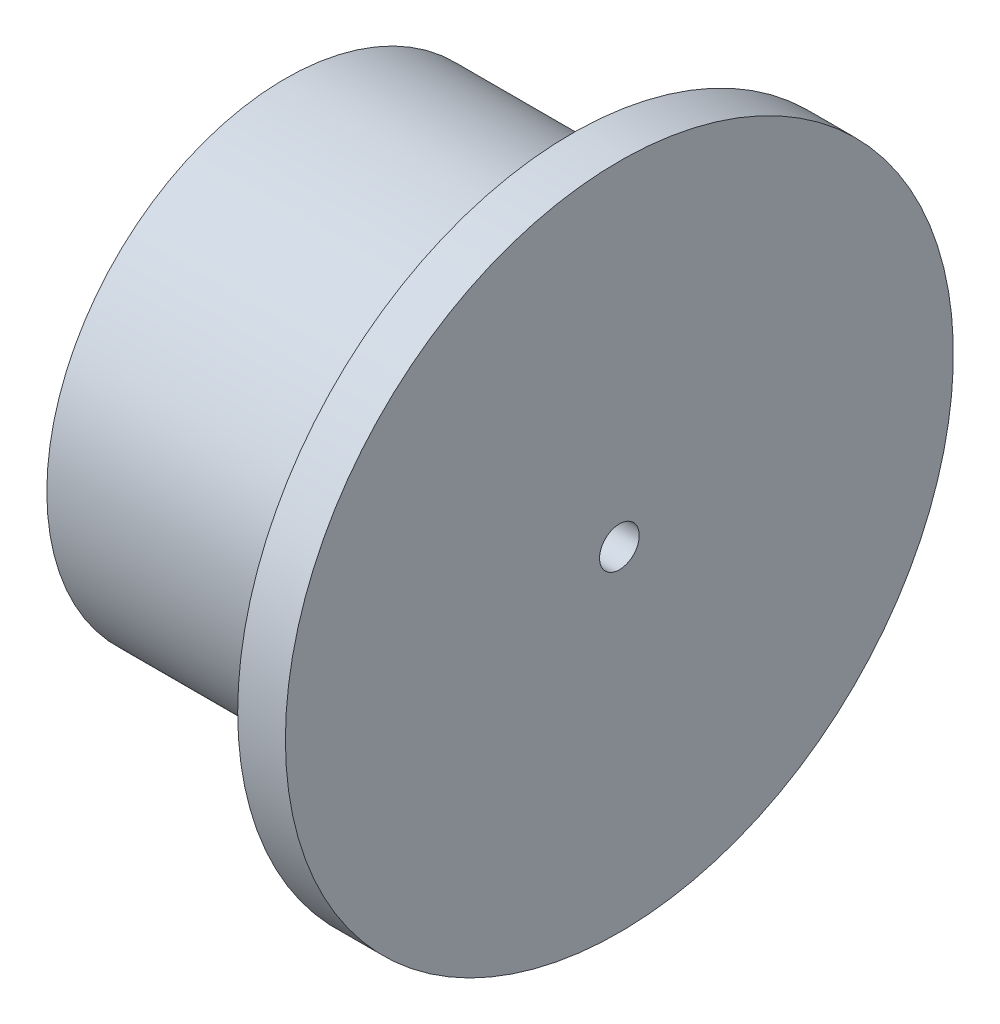
ISO-10303-21;
HEADER;
FILE_DESCRIPTION(('STEP AP214'),'2;1');
FILE_NAME('part.step','',(''),(''),'','','');
FILE_SCHEMA(('AUTOMOTIVE_DESIGN { 1 0 10303 214 1 1 1 1 }'));
ENDSEC;
DATA;
#1=APPLICATION_CONTEXT('core data for automotive mechanical design processes');
#2=APPLICATION_PROTOCOL_DEFINITION('international standard','automotive_design',2000,#1);
#3=PRODUCT_CONTEXT('',#1,'mechanical');
#4=PRODUCT('Part','Part','',(#3));
#5=PRODUCT_RELATED_PRODUCT_CATEGORY('part','',(#4));
#6=PRODUCT_DEFINITION_FORMATION('','',#4);
#7=PRODUCT_DEFINITION_CONTEXT('part definition',#1,'design');
#8=PRODUCT_DEFINITION('design','',#6,#7);
#9=PRODUCT_DEFINITION_SHAPE('','',#8);
#10=(LENGTH_UNIT() NAMED_UNIT(*) SI_UNIT(.MILLI.,.METRE.));
#11=(NAMED_UNIT(*) PLANE_ANGLE_UNIT() SI_UNIT($,.RADIAN.));
#12=(NAMED_UNIT(*) SI_UNIT($,.STERADIAN.) SOLID_ANGLE_UNIT());
#13=UNCERTAINTY_MEASURE_WITH_UNIT(LENGTH_MEASURE(1.E-05),#10,'distance_accuracy_value','');
#14=(GEOMETRIC_REPRESENTATION_CONTEXT(3) GLOBAL_UNCERTAINTY_ASSIGNED_CONTEXT((#13)) GLOBAL_UNIT_ASSIGNED_CONTEXT((#10,
#11,#12)) REPRESENTATION_CONTEXT('',''));
#15=CARTESIAN_POINT('',(0.,0.,0.));
#16=DIRECTION('',(0.,0.,1.));
#17=DIRECTION('',(1.,0.,0.));
#18=AXIS2_PLACEMENT_3D('',#15,#16,#17);
#19=CARTESIAN_POINT('',(3.80999999999997,25.4,0.));
#20=DIRECTION('',(1.,0.,0.));
#21=DIRECTION('',(0.,0.,-1.));
#22=AXIS2_PLACEMENT_3D('',#19,#20,#21);
#23=PLANE('',#22);
#24=CARTESIAN_POINT('',(3.80999999999997,-6.34999999999999,0.));
#25=DIRECTION('',(1.,0.,0.));
#26=DIRECTION('',(0.,0.,-1.));
#27=AXIS2_PLACEMENT_3D('',#24,#25,#26);
#28=CIRCLE('',#27,2.6416);
#29=CARTESIAN_POINT('',(3.80999999999997,-6.34999999999999,-2.6416));
#30=VERTEX_POINT('',#29);
#31=EDGE_CURVE('E60',#30,#30,#28,.T.);
#32=ORIENTED_EDGE('',*,*,#31,.T.);
#33=EDGE_LOOP('',(#32));
#34=FACE_BOUND('',#33,.T.);
#35=CARTESIAN_POINT('',(3.80999999999997,-6.34999999999999,0.));
#36=DIRECTION('',(-1.,0.,0.));
#37=DIRECTION('',(0.,0.,1.));
#38=AXIS2_PLACEMENT_3D('',#35,#36,#37);
#39=CIRCLE('',#38,31.75);
#40=CARTESIAN_POINT('',(3.80999999999997,-6.34999999999999,31.75));
#41=VERTEX_POINT('',#40);
#42=EDGE_CURVE('E10',#41,#41,#39,.T.);
#43=ORIENTED_EDGE('',*,*,#42,.T.);
#44=EDGE_LOOP('',(#43));
#45=FACE_BOUND('',#44,.T.);
#46=ADVANCED_FACE('F37',(#34,#45),#23,.F.);
#47=CARTESIAN_POINT('',(3.80999999999998,-6.34999999999999,0.));
#48=DIRECTION('',(-1.,0.,0.));
#49=DIRECTION('',(0.,0.,1.));
#50=AXIS2_PLACEMENT_3D('',#47,#48,#49);
#51=CYLINDRICAL_SURFACE('',#50,31.75);
#52=ORIENTED_EDGE('',*,*,#42,.F.);
#53=EDGE_LOOP('',(#52));
#54=FACE_BOUND('',#53,.T.);
#55=CARTESIAN_POINT('',(41.91,-6.34999999999999,0.));
#56=DIRECTION('',(-1.,0.,0.));
#57=DIRECTION('',(0.,0.,1.));
#58=AXIS2_PLACEMENT_3D('',#55,#56,#57);
#59=CIRCLE('',#58,31.75);
#60=CARTESIAN_POINT('',(41.91,-6.34999999999999,31.75));
#61=VERTEX_POINT('',#60);
#62=EDGE_CURVE('E44',#61,#61,#59,.T.);
#63=ORIENTED_EDGE('',*,*,#62,.T.);
#64=EDGE_LOOP('',(#63));
#65=FACE_BOUND('',#64,.T.);
#66=ADVANCED_FACE('F90',(#54,#65),#51,.T.);
#67=CARTESIAN_POINT('',(41.91,25.4,0.));
#68=DIRECTION('',(1.,0.,0.));
#69=DIRECTION('',(0.,0.,-1.));
#70=AXIS2_PLACEMENT_3D('',#67,#68,#69);
#71=PLANE('',#70);
#72=ORIENTED_EDGE('',*,*,#62,.F.);
#73=EDGE_LOOP('',(#72));
#74=FACE_BOUND('',#73,.T.);
#75=CARTESIAN_POINT('',(41.91,-6.34999999999999,0.));
#76=DIRECTION('',(-1.,0.,0.));
#77=DIRECTION('',(0.,0.,1.));
#78=AXIS2_PLACEMENT_3D('',#75,#76,#77);
#79=CIRCLE('',#78,44.45);
#80=CARTESIAN_POINT('',(41.91,-6.34999999999999,44.45));
#81=VERTEX_POINT('',#80);
#82=EDGE_CURVE('E49',#81,#81,#79,.T.);
#83=ORIENTED_EDGE('',*,*,#82,.T.);
#84=EDGE_LOOP('',(#83));
#85=FACE_BOUND('',#84,.T.);
#86=ADVANCED_FACE('F84',(#74,#85),#71,.F.);
#87=CARTESIAN_POINT('',(3.80999999999998,-6.34999999999999,0.));
#88=DIRECTION('',(-1.,0.,0.));
#89=DIRECTION('',(0.,0.,1.));
#90=AXIS2_PLACEMENT_3D('',#87,#88,#89);
#91=CYLINDRICAL_SURFACE('',#90,44.45);
#92=ORIENTED_EDGE('',*,*,#82,.F.);
#93=EDGE_LOOP('',(#92));
#94=FACE_BOUND('',#93,.T.);
#95=CARTESIAN_POINT('',(48.26,-6.34999999999999,0.));
#96=DIRECTION('',(-1.,0.,0.));
#97=DIRECTION('',(0.,0.,1.));
#98=AXIS2_PLACEMENT_3D('',#95,#96,#97);
#99=CIRCLE('',#98,44.45);
#100=CARTESIAN_POINT('',(48.26,-6.34999999999999,44.45));
#101=VERTEX_POINT('',#100);
#102=EDGE_CURVE('E54',#101,#101,#99,.T.);
#103=ORIENTED_EDGE('',*,*,#102,.T.);
#104=EDGE_LOOP('',(#103));
#105=FACE_BOUND('',#104,.T.);
#106=ADVANCED_FACE('F79',(#94,#105),#91,.T.);
#107=CARTESIAN_POINT('',(48.26,38.1,0.));
#108=DIRECTION('',(-1.,0.,0.));
#109=DIRECTION('',(0.,0.,1.));
#110=AXIS2_PLACEMENT_3D('',#107,#108,#109);
#111=PLANE('',#110);
#112=CARTESIAN_POINT('',(48.26,-6.34999999999999,0.));
#113=DIRECTION('',(1.,0.,0.));
#114=DIRECTION('',(0.,0.,-1.));
#115=AXIS2_PLACEMENT_3D('',#112,#113,#114);
#116=CIRCLE('',#115,2.6416);
#117=CARTESIAN_POINT('',(48.26,-6.34999999999999,-2.6416));
#118=VERTEX_POINT('',#117);
#119=EDGE_CURVE('E61',#118,#118,#116,.T.);
#120=ORIENTED_EDGE('',*,*,#119,.F.);
#121=EDGE_LOOP('',(#120));
#122=FACE_BOUND('',#121,.T.);
#123=ORIENTED_EDGE('',*,*,#102,.F.);
#124=EDGE_LOOP('',(#123));
#125=FACE_BOUND('',#124,.T.);
#126=ADVANCED_FACE('F73',(#122,#125),#111,.F.);
#127=CARTESIAN_POINT('',(3.80999999999997,-6.34999999999999,0.));
#128=DIRECTION('',(1.,0.,0.));
#129=DIRECTION('',(0.,0.,-1.));
#130=AXIS2_PLACEMENT_3D('',#127,#128,#129);
#131=CYLINDRICAL_SURFACE('',#130,2.6416);
#132=ORIENTED_EDGE('',*,*,#31,.F.);
#133=EDGE_LOOP('',(#132));
#134=FACE_BOUND('',#133,.T.);
#135=ORIENTED_EDGE('',*,*,#119,.T.);
#136=EDGE_LOOP('',(#135));
#137=FACE_BOUND('',#136,.T.);
#138=ADVANCED_FACE('F70',(#134,#137),#131,.F.);
#139=CLOSED_SHELL('',(#46,#66,#86,#106,#126,#138));
#140=MANIFOLD_SOLID_BREP('B2',#139);
#141=ADVANCED_BREP_SHAPE_REPRESENTATION('',(#18,#140),#14);
#142=SHAPE_DEFINITION_REPRESENTATION(#9,#141);
ENDSEC;
END-ISO-10303-21;
